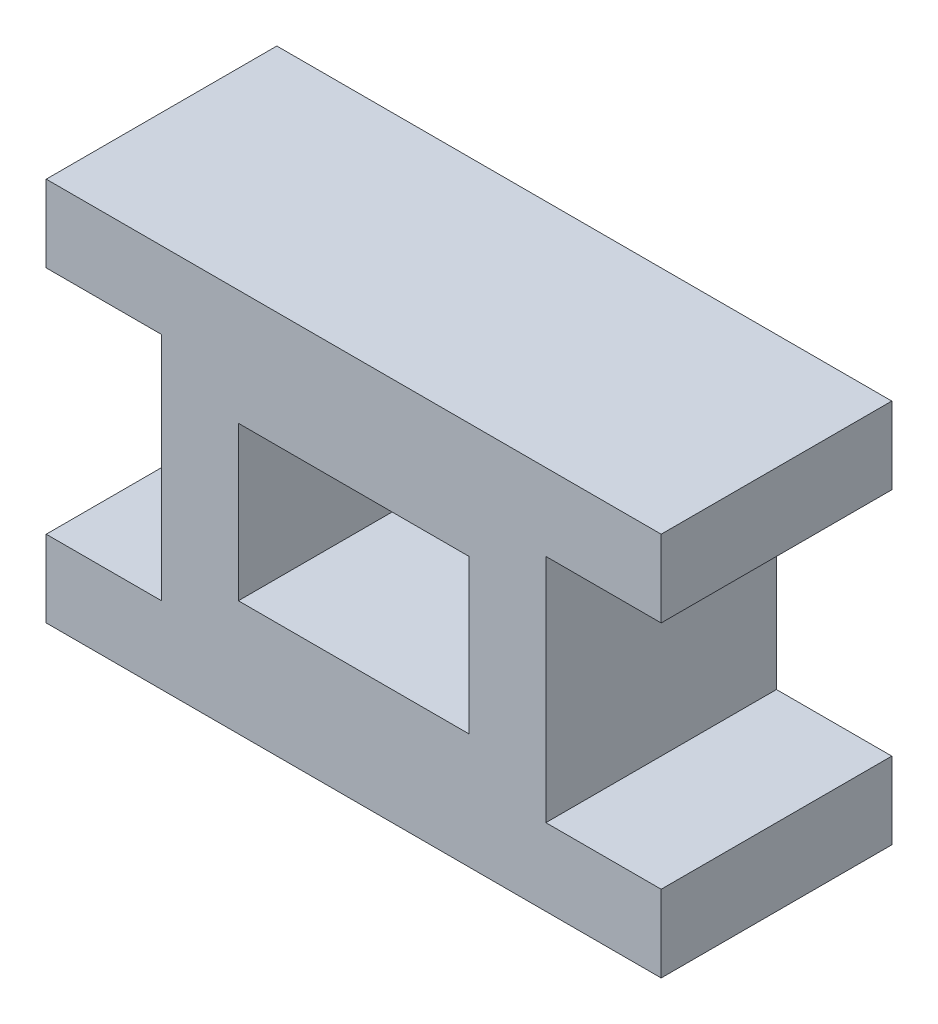
ISO-10303-21;
HEADER;
FILE_DESCRIPTION(('STEP AP214'),'2;1');
FILE_NAME('part.step','',(''),(''),'','','');
FILE_SCHEMA(('AUTOMOTIVE_DESIGN { 1 0 10303 214 1 1 1 1 }'));
ENDSEC;
DATA;
#1=APPLICATION_CONTEXT('core data for automotive mechanical design processes');
#2=APPLICATION_PROTOCOL_DEFINITION('international standard','automotive_design',2000,#1);
#3=PRODUCT_CONTEXT('',#1,'mechanical');
#4=PRODUCT('Part','Part','',(#3));
#5=PRODUCT_RELATED_PRODUCT_CATEGORY('part','',(#4));
#6=PRODUCT_DEFINITION_FORMATION('','',#4);
#7=PRODUCT_DEFINITION_CONTEXT('part definition',#1,'design');
#8=PRODUCT_DEFINITION('design','',#6,#7);
#9=PRODUCT_DEFINITION_SHAPE('','',#8);
#10=(LENGTH_UNIT() NAMED_UNIT(*) SI_UNIT(.MILLI.,.METRE.));
#11=(NAMED_UNIT(*) PLANE_ANGLE_UNIT() SI_UNIT($,.RADIAN.));
#12=(NAMED_UNIT(*) SI_UNIT($,.STERADIAN.) SOLID_ANGLE_UNIT());
#13=UNCERTAINTY_MEASURE_WITH_UNIT(LENGTH_MEASURE(1.E-05),#10,'distance_accuracy_value','');
#14=(GEOMETRIC_REPRESENTATION_CONTEXT(3) GLOBAL_UNCERTAINTY_ASSIGNED_CONTEXT((#13)) GLOBAL_UNIT_ASSIGNED_CONTEXT((#10,
#11,#12)) REPRESENTATION_CONTEXT('',''));
#15=CARTESIAN_POINT('',(0.,0.,0.));
#16=DIRECTION('',(0.,0.,1.));
#17=DIRECTION('',(1.,0.,0.));
#18=AXIS2_PLACEMENT_3D('',#15,#16,#17);
#19=CARTESIAN_POINT('',(0.,0.,15.));
#20=DIRECTION('',(0.,0.,-1.));
#21=DIRECTION('',(-1.,0.,0.));
#22=AXIS2_PLACEMENT_3D('',#19,#20,#21);
#23=PLANE('',#22);
#24=DIRECTION('',(0.,1.,0.));
#25=VECTOR('',#24,1.);
#26=CARTESIAN_POINT('',(40.,15.,15.));
#27=LINE('',#26,#25);
#28=CARTESIAN_POINT('',(40.,15.,15.));
#29=VERTEX_POINT('',#28);
#30=CARTESIAN_POINT('',(40.,25.,15.));
#31=VERTEX_POINT('',#30);
#32=EDGE_CURVE('E187',#29,#31,#27,.T.);
#33=ORIENTED_EDGE('',*,*,#32,.T.);
#34=DIRECTION('',(-1.,0.,0.));
#35=VECTOR('',#34,1.);
#36=CARTESIAN_POINT('',(-40.,25.,15.));
#37=LINE('',#36,#35);
#38=CARTESIAN_POINT('',(-40.,25.,15.));
#39=VERTEX_POINT('',#38);
#40=EDGE_CURVE('E192',#31,#39,#37,.T.);
#41=ORIENTED_EDGE('',*,*,#40,.T.);
#42=DIRECTION('',(0.,-1.,0.));
#43=VECTOR('',#42,1.);
#44=CARTESIAN_POINT('',(-40.,15.,15.));
#45=LINE('',#44,#43);
#46=CARTESIAN_POINT('',(-40.,15.,15.));
#47=VERTEX_POINT('',#46);
#48=EDGE_CURVE('E191',#39,#47,#45,.T.);
#49=ORIENTED_EDGE('',*,*,#48,.T.);
#50=DIRECTION('',(1.,0.,0.));
#51=VECTOR('',#50,1.);
#52=CARTESIAN_POINT('',(-40.,15.,15.));
#53=LINE('',#52,#51);
#54=CARTESIAN_POINT('',(-25.,15.,15.));
#55=VERTEX_POINT('',#54);
#56=EDGE_CURVE('E196',#47,#55,#53,.T.);
#57=ORIENTED_EDGE('',*,*,#56,.T.);
#58=DIRECTION('',(0.,-1.,0.));
#59=VECTOR('',#58,1.);
#60=CARTESIAN_POINT('',(-25.,15.,15.));
#61=LINE('',#60,#59);
#62=CARTESIAN_POINT('',(-25.,-15.,15.));
#63=VERTEX_POINT('',#62);
#64=EDGE_CURVE('E199',#55,#63,#61,.T.);
#65=ORIENTED_EDGE('',*,*,#64,.T.);
#66=DIRECTION('',(-1.,0.,0.));
#67=VECTOR('',#66,1.);
#68=CARTESIAN_POINT('',(-25.,-15.,15.));
#69=LINE('',#68,#67);
#70=CARTESIAN_POINT('',(-40.,-15.,15.));
#71=VERTEX_POINT('',#70);
#72=EDGE_CURVE('E200',#63,#71,#69,.T.);
#73=ORIENTED_EDGE('',*,*,#72,.T.);
#74=DIRECTION('',(0.,-1.,0.));
#75=VECTOR('',#74,1.);
#76=CARTESIAN_POINT('',(-40.,-25.,15.));
#77=LINE('',#76,#75);
#78=CARTESIAN_POINT('',(-40.,-25.,15.));
#79=VERTEX_POINT('',#78);
#80=EDGE_CURVE('E205',#71,#79,#77,.T.);
#81=ORIENTED_EDGE('',*,*,#80,.T.);
#82=DIRECTION('',(1.,0.,0.));
#83=VECTOR('',#82,1.);
#84=CARTESIAN_POINT('',(-40.,-25.,15.));
#85=LINE('',#84,#83);
#86=CARTESIAN_POINT('',(40.,-25.,15.));
#87=VERTEX_POINT('',#86);
#88=EDGE_CURVE('E204',#79,#87,#85,.T.);
#89=ORIENTED_EDGE('',*,*,#88,.T.);
#90=DIRECTION('',(0.,1.,0.));
#91=VECTOR('',#90,1.);
#92=CARTESIAN_POINT('',(40.,-25.,15.));
#93=LINE('',#92,#91);
#94=CARTESIAN_POINT('',(40.,-15.,15.));
#95=VERTEX_POINT('',#94);
#96=EDGE_CURVE('E206',#87,#95,#93,.T.);
#97=ORIENTED_EDGE('',*,*,#96,.T.);
#98=DIRECTION('',(-1.,0.,0.));
#99=VECTOR('',#98,1.);
#100=CARTESIAN_POINT('',(25.,-15.,15.));
#101=LINE('',#100,#99);
#102=CARTESIAN_POINT('',(25.,-15.,15.));
#103=VERTEX_POINT('',#102);
#104=EDGE_CURVE('E209',#95,#103,#101,.T.);
#105=ORIENTED_EDGE('',*,*,#104,.T.);
#106=DIRECTION('',(0.,1.,0.));
#107=VECTOR('',#106,1.);
#108=CARTESIAN_POINT('',(25.,15.,15.));
#109=LINE('',#108,#107);
#110=CARTESIAN_POINT('',(25.,15.,15.));
#111=VERTEX_POINT('',#110);
#112=EDGE_CURVE('E210',#103,#111,#109,.T.);
#113=ORIENTED_EDGE('',*,*,#112,.T.);
#114=DIRECTION('',(1.,0.,0.));
#115=VECTOR('',#114,1.);
#116=CARTESIAN_POINT('',(40.,15.,15.));
#117=LINE('',#116,#115);
#118=EDGE_CURVE('E212',#111,#29,#117,.T.);
#119=ORIENTED_EDGE('',*,*,#118,.T.);
#120=EDGE_LOOP('',(#33,#41,#49,#57,#65,#73,#81,#89,#97,#105,#113,#119));
#121=FACE_BOUND('',#120,.T.);
#122=DIRECTION('',(0.,1.,0.));
#123=VECTOR('',#122,1.);
#124=CARTESIAN_POINT('',(15.,-10.,15.));
#125=LINE('',#124,#123);
#126=CARTESIAN_POINT('',(15.,-10.,15.));
#127=VERTEX_POINT('',#126);
#128=CARTESIAN_POINT('',(15.,10.,15.));
#129=VERTEX_POINT('',#128);
#130=EDGE_CURVE('E152',#127,#129,#125,.T.);
#131=ORIENTED_EDGE('',*,*,#130,.F.);
#132=DIRECTION('',(1.,0.,0.));
#133=VECTOR('',#132,1.);
#134=CARTESIAN_POINT('',(-15.,-10.,15.));
#135=LINE('',#134,#133);
#136=CARTESIAN_POINT('',(-15.,-10.,15.));
#137=VERTEX_POINT('',#136);
#138=EDGE_CURVE('E174',#137,#127,#135,.T.);
#139=ORIENTED_EDGE('',*,*,#138,.F.);
#140=DIRECTION('',(0.,-1.,0.));
#141=VECTOR('',#140,1.);
#142=CARTESIAN_POINT('',(-15.,-10.,15.));
#143=LINE('',#142,#141);
#144=CARTESIAN_POINT('',(-15.,10.,15.));
#145=VERTEX_POINT('',#144);
#146=EDGE_CURVE('E175',#145,#137,#143,.T.);
#147=ORIENTED_EDGE('',*,*,#146,.F.);
#148=DIRECTION('',(-1.,0.,0.));
#149=VECTOR('',#148,1.);
#150=CARTESIAN_POINT('',(-15.,10.,15.));
#151=LINE('',#150,#149);
#152=EDGE_CURVE('E158',#129,#145,#151,.T.);
#153=ORIENTED_EDGE('',*,*,#152,.F.);
#154=EDGE_LOOP('',(#131,#139,#147,#153));
#155=FACE_BOUND('',#154,.T.);
#156=ADVANCED_FACE('F39',(#121,#155),#23,.F.);
#157=CARTESIAN_POINT('',(0.,0.,-15.));
#158=DIRECTION('',(0.,0.,-1.));
#159=DIRECTION('',(-1.,0.,0.));
#160=AXIS2_PLACEMENT_3D('',#157,#158,#159);
#161=PLANE('',#160);
#162=DIRECTION('',(0.,1.,0.));
#163=VECTOR('',#162,1.);
#164=CARTESIAN_POINT('',(40.,15.,-15.));
#165=LINE('',#164,#163);
#166=CARTESIAN_POINT('',(40.,15.,-15.));
#167=VERTEX_POINT('',#166);
#168=CARTESIAN_POINT('',(40.,25.,-15.));
#169=VERTEX_POINT('',#168);
#170=EDGE_CURVE('E166',#167,#169,#165,.T.);
#171=ORIENTED_EDGE('',*,*,#170,.F.);
#172=DIRECTION('',(1.,0.,0.));
#173=VECTOR('',#172,1.);
#174=CARTESIAN_POINT('',(40.,15.,-15.));
#175=LINE('',#174,#173);
#176=CARTESIAN_POINT('',(25.,15.,-15.));
#177=VERTEX_POINT('',#176);
#178=EDGE_CURVE('E195',#177,#167,#175,.T.);
#179=ORIENTED_EDGE('',*,*,#178,.F.);
#180=DIRECTION('',(0.,1.,0.));
#181=VECTOR('',#180,1.);
#182=CARTESIAN_POINT('',(25.,15.,-15.));
#183=LINE('',#182,#181);
#184=CARTESIAN_POINT('',(25.,-15.,-15.));
#185=VERTEX_POINT('',#184);
#186=EDGE_CURVE('E234',#185,#177,#183,.T.);
#187=ORIENTED_EDGE('',*,*,#186,.F.);
#188=DIRECTION('',(-1.,0.,0.));
#189=VECTOR('',#188,1.);
#190=CARTESIAN_POINT('',(25.,-15.,-15.));
#191=LINE('',#190,#189);
#192=CARTESIAN_POINT('',(40.,-15.,-15.));
#193=VERTEX_POINT('',#192);
#194=EDGE_CURVE('E232',#193,#185,#191,.T.);
#195=ORIENTED_EDGE('',*,*,#194,.F.);
#196=DIRECTION('',(0.,1.,0.));
#197=VECTOR('',#196,1.);
#198=CARTESIAN_POINT('',(40.,-25.,-15.));
#199=LINE('',#198,#197);
#200=CARTESIAN_POINT('',(40.,-25.,-15.));
#201=VERTEX_POINT('',#200);
#202=EDGE_CURVE('E231',#201,#193,#199,.T.);
#203=ORIENTED_EDGE('',*,*,#202,.F.);
#204=DIRECTION('',(1.,0.,0.));
#205=VECTOR('',#204,1.);
#206=CARTESIAN_POINT('',(-40.,-25.,-15.));
#207=LINE('',#206,#205);
#208=CARTESIAN_POINT('',(-40.,-25.,-15.));
#209=VERTEX_POINT('',#208);
#210=EDGE_CURVE('E227',#209,#201,#207,.T.);
#211=ORIENTED_EDGE('',*,*,#210,.F.);
#212=DIRECTION('',(0.,-1.,0.));
#213=VECTOR('',#212,1.);
#214=CARTESIAN_POINT('',(-40.,-25.,-15.));
#215=LINE('',#214,#213);
#216=CARTESIAN_POINT('',(-40.,-15.,-15.));
#217=VERTEX_POINT('',#216);
#218=EDGE_CURVE('E230',#217,#209,#215,.T.);
#219=ORIENTED_EDGE('',*,*,#218,.F.);
#220=DIRECTION('',(-1.,0.,0.));
#221=VECTOR('',#220,1.);
#222=CARTESIAN_POINT('',(-25.,-15.,-15.));
#223=LINE('',#222,#221);
#224=CARTESIAN_POINT('',(-25.,-15.,-15.));
#225=VERTEX_POINT('',#224);
#226=EDGE_CURVE('E224',#225,#217,#223,.T.);
#227=ORIENTED_EDGE('',*,*,#226,.F.);
#228=DIRECTION('',(0.,-1.,0.));
#229=VECTOR('',#228,1.);
#230=CARTESIAN_POINT('',(-25.,15.,-15.));
#231=LINE('',#230,#229);
#232=CARTESIAN_POINT('',(-25.,15.,-15.));
#233=VERTEX_POINT('',#232);
#234=EDGE_CURVE('E223',#233,#225,#231,.T.);
#235=ORIENTED_EDGE('',*,*,#234,.F.);
#236=DIRECTION('',(1.,0.,0.));
#237=VECTOR('',#236,1.);
#238=CARTESIAN_POINT('',(-40.,15.,-15.));
#239=LINE('',#238,#237);
#240=CARTESIAN_POINT('',(-40.,15.,-15.));
#241=VERTEX_POINT('',#240);
#242=EDGE_CURVE('E221',#241,#233,#239,.T.);
#243=ORIENTED_EDGE('',*,*,#242,.F.);
#244=DIRECTION('',(0.,-1.,0.));
#245=VECTOR('',#244,1.);
#246=CARTESIAN_POINT('',(-40.,15.,-15.));
#247=LINE('',#246,#245);
#248=CARTESIAN_POINT('',(-40.,25.,-15.));
#249=VERTEX_POINT('',#248);
#250=EDGE_CURVE('E219',#249,#241,#247,.T.);
#251=ORIENTED_EDGE('',*,*,#250,.F.);
#252=DIRECTION('',(-1.,0.,0.));
#253=VECTOR('',#252,1.);
#254=CARTESIAN_POINT('',(-40.,25.,-15.));
#255=LINE('',#254,#253);
#256=EDGE_CURVE('E220',#169,#249,#255,.T.);
#257=ORIENTED_EDGE('',*,*,#256,.F.);
#258=EDGE_LOOP('',(#171,#179,#187,#195,#203,#211,#219,#227,#235,#243,#251,#257));
#259=FACE_BOUND('',#258,.T.);
#260=DIRECTION('',(1.,0.,0.));
#261=VECTOR('',#260,1.);
#262=CARTESIAN_POINT('',(-15.,-10.,-15.));
#263=LINE('',#262,#261);
#264=CARTESIAN_POINT('',(-15.,-10.,-15.));
#265=VERTEX_POINT('',#264);
#266=CARTESIAN_POINT('',(15.,-10.,-15.));
#267=VERTEX_POINT('',#266);
#268=EDGE_CURVE('E161',#265,#267,#263,.T.);
#269=ORIENTED_EDGE('',*,*,#268,.T.);
#270=DIRECTION('',(0.,1.,0.));
#271=VECTOR('',#270,1.);
#272=CARTESIAN_POINT('',(15.,-10.,-15.));
#273=LINE('',#272,#271);
#274=CARTESIAN_POINT('',(15.,10.,-15.));
#275=VERTEX_POINT('',#274);
#276=EDGE_CURVE('E62',#267,#275,#273,.T.);
#277=ORIENTED_EDGE('',*,*,#276,.T.);
#278=DIRECTION('',(-1.,0.,0.));
#279=VECTOR('',#278,1.);
#280=CARTESIAN_POINT('',(-15.,10.,-15.));
#281=LINE('',#280,#279);
#282=CARTESIAN_POINT('',(-15.,10.,-15.));
#283=VERTEX_POINT('',#282);
#284=EDGE_CURVE('E167',#275,#283,#281,.T.);
#285=ORIENTED_EDGE('',*,*,#284,.T.);
#286=DIRECTION('',(0.,-1.,0.));
#287=VECTOR('',#286,1.);
#288=CARTESIAN_POINT('',(-15.,-10.,-15.));
#289=LINE('',#288,#287);
#290=EDGE_CURVE('E179',#283,#265,#289,.T.);
#291=ORIENTED_EDGE('',*,*,#290,.T.);
#292=EDGE_LOOP('',(#269,#277,#285,#291));
#293=FACE_BOUND('',#292,.T.);
#294=ADVANCED_FACE('F280',(#259,#293),#161,.T.);
#295=CARTESIAN_POINT('',(40.,15.,15.));
#296=DIRECTION('',(-1.,0.,0.));
#297=DIRECTION('',(0.,-1.,0.));
#298=AXIS2_PLACEMENT_3D('',#295,#296,#297);
#299=PLANE('',#298);
#300=ORIENTED_EDGE('',*,*,#170,.T.);
#301=DIRECTION('',(0.,0.,-1.));
#302=VECTOR('',#301,1.);
#303=CARTESIAN_POINT('',(40.,25.,15.));
#304=LINE('',#303,#302);
#305=EDGE_CURVE('E11',#31,#169,#304,.T.);
#306=ORIENTED_EDGE('',*,*,#305,.F.);
#307=ORIENTED_EDGE('',*,*,#32,.F.);
#308=DIRECTION('',(0.,0.,-1.));
#309=VECTOR('',#308,1.);
#310=CARTESIAN_POINT('',(40.,15.,15.));
#311=LINE('',#310,#309);
#312=EDGE_CURVE('E215',#29,#167,#311,.T.);
#313=ORIENTED_EDGE('',*,*,#312,.T.);
#314=EDGE_LOOP('',(#300,#306,#307,#313));
#315=FACE_BOUND('',#314,.T.);
#316=ADVANCED_FACE('F41',(#315),#299,.F.);
#317=CARTESIAN_POINT('',(-40.,25.,15.));
#318=DIRECTION('',(0.,-1.,0.));
#319=DIRECTION('',(0.,0.,-1.));
#320=AXIS2_PLACEMENT_3D('',#317,#318,#319);
#321=PLANE('',#320);
#322=ORIENTED_EDGE('',*,*,#256,.T.);
#323=DIRECTION('',(0.,0.,-1.));
#324=VECTOR('',#323,1.);
#325=CARTESIAN_POINT('',(-40.,25.,15.));
#326=LINE('',#325,#324);
#327=EDGE_CURVE('E50',#39,#249,#326,.T.);
#328=ORIENTED_EDGE('',*,*,#327,.F.);
#329=ORIENTED_EDGE('',*,*,#40,.F.);
#330=ORIENTED_EDGE('',*,*,#305,.T.);
#331=EDGE_LOOP('',(#322,#328,#329,#330));
#332=FACE_BOUND('',#331,.T.);
#333=ADVANCED_FACE('F294',(#332),#321,.F.);
#334=CARTESIAN_POINT('',(-40.,15.,15.));
#335=DIRECTION('',(1.,0.,0.));
#336=DIRECTION('',(0.,1.,0.));
#337=AXIS2_PLACEMENT_3D('',#334,#335,#336);
#338=PLANE('',#337);
#339=ORIENTED_EDGE('',*,*,#250,.T.);
#340=DIRECTION('',(0.,0.,-1.));
#341=VECTOR('',#340,1.);
#342=CARTESIAN_POINT('',(-40.,15.,15.));
#343=LINE('',#342,#341);
#344=EDGE_CURVE('E264',#47,#241,#343,.T.);
#345=ORIENTED_EDGE('',*,*,#344,.F.);
#346=ORIENTED_EDGE('',*,*,#48,.F.);
#347=ORIENTED_EDGE('',*,*,#327,.T.);
#348=EDGE_LOOP('',(#339,#345,#346,#347));
#349=FACE_BOUND('',#348,.T.);
#350=ADVANCED_FACE('F271',(#349),#338,.F.);
#351=CARTESIAN_POINT('',(-40.,15.,15.));
#352=DIRECTION('',(0.,1.,0.));
#353=DIRECTION('',(0.,0.,1.));
#354=AXIS2_PLACEMENT_3D('',#351,#352,#353);
#355=PLANE('',#354);
#356=ORIENTED_EDGE('',*,*,#242,.T.);
#357=DIRECTION('',(0.,0.,-1.));
#358=VECTOR('',#357,1.);
#359=CARTESIAN_POINT('',(-25.,15.,15.));
#360=LINE('',#359,#358);
#361=EDGE_CURVE('E263',#55,#233,#360,.T.);
#362=ORIENTED_EDGE('',*,*,#361,.F.);
#363=ORIENTED_EDGE('',*,*,#56,.F.);
#364=ORIENTED_EDGE('',*,*,#344,.T.);
#365=EDGE_LOOP('',(#356,#362,#363,#364));
#366=FACE_BOUND('',#365,.T.);
#367=ADVANCED_FACE('F284',(#366),#355,.F.);
#368=CARTESIAN_POINT('',(-25.,15.,15.));
#369=DIRECTION('',(1.,0.,0.));
#370=DIRECTION('',(0.,0.,-1.));
#371=AXIS2_PLACEMENT_3D('',#368,#369,#370);
#372=PLANE('',#371);
#373=ORIENTED_EDGE('',*,*,#234,.T.);
#374=DIRECTION('',(0.,0.,-1.));
#375=VECTOR('',#374,1.);
#376=CARTESIAN_POINT('',(-25.,-15.,15.));
#377=LINE('',#376,#375);
#378=EDGE_CURVE('E256',#63,#225,#377,.T.);
#379=ORIENTED_EDGE('',*,*,#378,.F.);
#380=ORIENTED_EDGE('',*,*,#64,.F.);
#381=ORIENTED_EDGE('',*,*,#361,.T.);
#382=EDGE_LOOP('',(#373,#379,#380,#381));
#383=FACE_BOUND('',#382,.T.);
#384=ADVANCED_FACE('F287',(#383),#372,.F.);
#385=CARTESIAN_POINT('',(-25.,-15.,15.));
#386=DIRECTION('',(0.,-1.,0.));
#387=DIRECTION('',(0.,0.,-1.));
#388=AXIS2_PLACEMENT_3D('',#385,#386,#387);
#389=PLANE('',#388);
#390=ORIENTED_EDGE('',*,*,#226,.T.);
#391=DIRECTION('',(0.,0.,-1.));
#392=VECTOR('',#391,1.);
#393=CARTESIAN_POINT('',(-40.,-15.,15.));
#394=LINE('',#393,#392);
#395=EDGE_CURVE('E255',#71,#217,#394,.T.);
#396=ORIENTED_EDGE('',*,*,#395,.F.);
#397=ORIENTED_EDGE('',*,*,#72,.F.);
#398=ORIENTED_EDGE('',*,*,#378,.T.);
#399=EDGE_LOOP('',(#390,#396,#397,#398));
#400=FACE_BOUND('',#399,.T.);
#401=ADVANCED_FACE('F330',(#400),#389,.F.);
#402=CARTESIAN_POINT('',(-40.,-25.,15.));
#403=DIRECTION('',(1.,0.,0.));
#404=DIRECTION('',(0.,1.,0.));
#405=AXIS2_PLACEMENT_3D('',#402,#403,#404);
#406=PLANE('',#405);
#407=ORIENTED_EDGE('',*,*,#218,.T.);
#408=DIRECTION('',(0.,0.,-1.));
#409=VECTOR('',#408,1.);
#410=CARTESIAN_POINT('',(-40.,-25.,15.));
#411=LINE('',#410,#409);
#412=EDGE_CURVE('E252',#79,#209,#411,.T.);
#413=ORIENTED_EDGE('',*,*,#412,.F.);
#414=ORIENTED_EDGE('',*,*,#80,.F.);
#415=ORIENTED_EDGE('',*,*,#395,.T.);
#416=EDGE_LOOP('',(#407,#413,#414,#415));
#417=FACE_BOUND('',#416,.T.);
#418=ADVANCED_FACE('F324',(#417),#406,.F.);
#419=CARTESIAN_POINT('',(-40.,-25.,15.));
#420=DIRECTION('',(0.,1.,0.));
#421=DIRECTION('',(0.,0.,1.));
#422=AXIS2_PLACEMENT_3D('',#419,#420,#421);
#423=PLANE('',#422);
#424=ORIENTED_EDGE('',*,*,#210,.T.);
#425=DIRECTION('',(0.,0.,-1.));
#426=VECTOR('',#425,1.);
#427=CARTESIAN_POINT('',(40.,-25.,15.));
#428=LINE('',#427,#426);
#429=EDGE_CURVE('E249',#87,#201,#428,.T.);
#430=ORIENTED_EDGE('',*,*,#429,.F.);
#431=ORIENTED_EDGE('',*,*,#88,.F.);
#432=ORIENTED_EDGE('',*,*,#412,.T.);
#433=EDGE_LOOP('',(#424,#430,#431,#432));
#434=FACE_BOUND('',#433,.T.);
#435=ADVANCED_FACE('F321',(#434),#423,.F.);
#436=CARTESIAN_POINT('',(40.,-25.,15.));
#437=DIRECTION('',(-1.,0.,0.));
#438=DIRECTION('',(0.,-1.,0.));
#439=AXIS2_PLACEMENT_3D('',#436,#437,#438);
#440=PLANE('',#439);
#441=ORIENTED_EDGE('',*,*,#202,.T.);
#442=DIRECTION('',(0.,0.,-1.));
#443=VECTOR('',#442,1.);
#444=CARTESIAN_POINT('',(40.,-15.,15.));
#445=LINE('',#444,#443);
#446=EDGE_CURVE('E247',#95,#193,#445,.T.);
#447=ORIENTED_EDGE('',*,*,#446,.F.);
#448=ORIENTED_EDGE('',*,*,#96,.F.);
#449=ORIENTED_EDGE('',*,*,#429,.T.);
#450=EDGE_LOOP('',(#441,#447,#448,#449));
#451=FACE_BOUND('',#450,.T.);
#452=ADVANCED_FACE('F316',(#451),#440,.F.);
#453=CARTESIAN_POINT('',(25.,-15.,15.));
#454=DIRECTION('',(0.,-1.,0.));
#455=DIRECTION('',(0.,0.,-1.));
#456=AXIS2_PLACEMENT_3D('',#453,#454,#455);
#457=PLANE('',#456);
#458=ORIENTED_EDGE('',*,*,#194,.T.);
#459=DIRECTION('',(0.,0.,-1.));
#460=VECTOR('',#459,1.);
#461=CARTESIAN_POINT('',(25.,-15.,15.));
#462=LINE('',#461,#460);
#463=EDGE_CURVE('E244',#103,#185,#462,.T.);
#464=ORIENTED_EDGE('',*,*,#463,.F.);
#465=ORIENTED_EDGE('',*,*,#104,.F.);
#466=ORIENTED_EDGE('',*,*,#446,.T.);
#467=EDGE_LOOP('',(#458,#464,#465,#466));
#468=FACE_BOUND('',#467,.T.);
#469=ADVANCED_FACE('F307',(#468),#457,.F.);
#470=CARTESIAN_POINT('',(25.,15.,15.));
#471=DIRECTION('',(-1.,0.,0.));
#472=DIRECTION('',(0.,0.,1.));
#473=AXIS2_PLACEMENT_3D('',#470,#471,#472);
#474=PLANE('',#473);
#475=ORIENTED_EDGE('',*,*,#186,.T.);
#476=DIRECTION('',(0.,0.,-1.));
#477=VECTOR('',#476,1.);
#478=CARTESIAN_POINT('',(25.,15.,15.));
#479=LINE('',#478,#477);
#480=EDGE_CURVE('E238',#111,#177,#479,.T.);
#481=ORIENTED_EDGE('',*,*,#480,.F.);
#482=ORIENTED_EDGE('',*,*,#112,.F.);
#483=ORIENTED_EDGE('',*,*,#463,.T.);
#484=EDGE_LOOP('',(#475,#481,#482,#483));
#485=FACE_BOUND('',#484,.T.);
#486=ADVANCED_FACE('F308',(#485),#474,.F.);
#487=CARTESIAN_POINT('',(40.,15.,15.));
#488=DIRECTION('',(0.,1.,0.));
#489=DIRECTION('',(0.,0.,1.));
#490=AXIS2_PLACEMENT_3D('',#487,#488,#489);
#491=PLANE('',#490);
#492=ORIENTED_EDGE('',*,*,#178,.T.);
#493=ORIENTED_EDGE('',*,*,#312,.F.);
#494=ORIENTED_EDGE('',*,*,#118,.F.);
#495=ORIENTED_EDGE('',*,*,#480,.T.);
#496=EDGE_LOOP('',(#492,#493,#494,#495));
#497=FACE_BOUND('',#496,.T.);
#498=ADVANCED_FACE('F303',(#497),#491,.F.);
#499=CARTESIAN_POINT('',(15.,-10.,15.));
#500=DIRECTION('',(-1.,0.,0.));
#501=DIRECTION('',(0.,0.,1.));
#502=AXIS2_PLACEMENT_3D('',#499,#500,#501);
#503=PLANE('',#502);
#504=ORIENTED_EDGE('',*,*,#276,.F.);
#505=DIRECTION('',(0.,0.,-1.));
#506=VECTOR('',#505,1.);
#507=CARTESIAN_POINT('',(15.,-10.,15.));
#508=LINE('',#507,#506);
#509=EDGE_CURVE('E157',#127,#267,#508,.T.);
#510=ORIENTED_EDGE('',*,*,#509,.F.);
#511=ORIENTED_EDGE('',*,*,#130,.T.);
#512=DIRECTION('',(0.,0.,-1.));
#513=VECTOR('',#512,1.);
#514=CARTESIAN_POINT('',(15.,10.,15.));
#515=LINE('',#514,#513);
#516=EDGE_CURVE('E155',#129,#275,#515,.T.);
#517=ORIENTED_EDGE('',*,*,#516,.T.);
#518=EDGE_LOOP('',(#504,#510,#511,#517));
#519=FACE_BOUND('',#518,.T.);
#520=ADVANCED_FACE('F153',(#519),#503,.T.);
#521=CARTESIAN_POINT('',(-15.,10.,15.));
#522=DIRECTION('',(0.,-1.,0.));
#523=DIRECTION('',(0.,0.,-1.));
#524=AXIS2_PLACEMENT_3D('',#521,#522,#523);
#525=PLANE('',#524);
#526=ORIENTED_EDGE('',*,*,#284,.F.);
#527=ORIENTED_EDGE('',*,*,#516,.F.);
#528=ORIENTED_EDGE('',*,*,#152,.T.);
#529=DIRECTION('',(0.,0.,-1.));
#530=VECTOR('',#529,1.);
#531=CARTESIAN_POINT('',(-15.,10.,15.));
#532=LINE('',#531,#530);
#533=EDGE_CURVE('E170',#145,#283,#532,.T.);
#534=ORIENTED_EDGE('',*,*,#533,.T.);
#535=EDGE_LOOP('',(#526,#527,#528,#534));
#536=FACE_BOUND('',#535,.T.);
#537=ADVANCED_FACE('F163',(#536),#525,.T.);
#538=CARTESIAN_POINT('',(-15.,-10.,15.));
#539=DIRECTION('',(1.,0.,0.));
#540=DIRECTION('',(0.,0.,-1.));
#541=AXIS2_PLACEMENT_3D('',#538,#539,#540);
#542=PLANE('',#541);
#543=ORIENTED_EDGE('',*,*,#290,.F.);
#544=ORIENTED_EDGE('',*,*,#533,.F.);
#545=ORIENTED_EDGE('',*,*,#146,.T.);
#546=DIRECTION('',(0.,0.,-1.));
#547=VECTOR('',#546,1.);
#548=CARTESIAN_POINT('',(-15.,-10.,15.));
#549=LINE('',#548,#547);
#550=EDGE_CURVE('E53',#137,#265,#549,.T.);
#551=ORIENTED_EDGE('',*,*,#550,.T.);
#552=EDGE_LOOP('',(#543,#544,#545,#551));
#553=FACE_BOUND('',#552,.T.);
#554=ADVANCED_FACE('F393',(#553),#542,.T.);
#555=CARTESIAN_POINT('',(-15.,-10.,15.));
#556=DIRECTION('',(0.,1.,0.));
#557=DIRECTION('',(0.,0.,1.));
#558=AXIS2_PLACEMENT_3D('',#555,#556,#557);
#559=PLANE('',#558);
#560=ORIENTED_EDGE('',*,*,#268,.F.);
#561=ORIENTED_EDGE('',*,*,#550,.F.);
#562=ORIENTED_EDGE('',*,*,#138,.T.);
#563=ORIENTED_EDGE('',*,*,#509,.T.);
#564=EDGE_LOOP('',(#560,#561,#562,#563));
#565=FACE_BOUND('',#564,.T.);
#566=ADVANCED_FACE('F396',(#565),#559,.T.);
#567=CLOSED_SHELL('',(#156,#294,#316,#333,#350,#367,#384,#401,#418,#435,#452,#469,#486,#498,
#520,#537,#554,#566));
#568=MANIFOLD_SOLID_BREP('B2',#567);
#569=ADVANCED_BREP_SHAPE_REPRESENTATION('',(#18,#568),#14);
#570=SHAPE_DEFINITION_REPRESENTATION(#9,#569);
ENDSEC;
END-ISO-10303-21;
